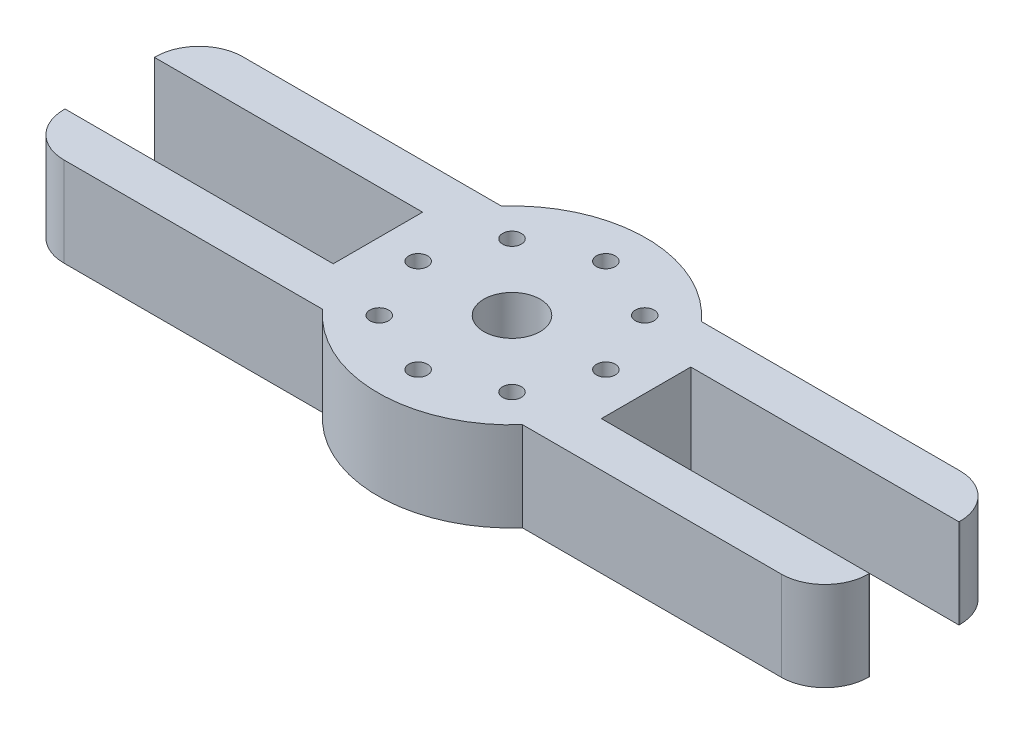
ISO-10303-21;
HEADER;
FILE_DESCRIPTION(('STEP AP214'),'2;1');
FILE_NAME('part.step','',(''),(''),'','','');
FILE_SCHEMA(('AUTOMOTIVE_DESIGN { 1 0 10303 214 1 1 1 1 }'));
ENDSEC;
DATA;
#1=APPLICATION_CONTEXT('core data for automotive mechanical design processes');
#2=APPLICATION_PROTOCOL_DEFINITION('international standard','automotive_design',2000,#1);
#3=PRODUCT_CONTEXT('',#1,'mechanical');
#4=PRODUCT('Part','Part','',(#3));
#5=PRODUCT_RELATED_PRODUCT_CATEGORY('part','',(#4));
#6=PRODUCT_DEFINITION_FORMATION('','',#4);
#7=PRODUCT_DEFINITION_CONTEXT('part definition',#1,'design');
#8=PRODUCT_DEFINITION('design','',#6,#7);
#9=PRODUCT_DEFINITION_SHAPE('','',#8);
#10=(LENGTH_UNIT() NAMED_UNIT(*) SI_UNIT(.MILLI.,.METRE.));
#11=(NAMED_UNIT(*) PLANE_ANGLE_UNIT() SI_UNIT($,.RADIAN.));
#12=(NAMED_UNIT(*) SI_UNIT($,.STERADIAN.) SOLID_ANGLE_UNIT());
#13=UNCERTAINTY_MEASURE_WITH_UNIT(LENGTH_MEASURE(1.E-05),#10,'distance_accuracy_value','');
#14=(GEOMETRIC_REPRESENTATION_CONTEXT(3) GLOBAL_UNCERTAINTY_ASSIGNED_CONTEXT((#13)) GLOBAL_UNIT_ASSIGNED_CONTEXT((#10,
#11,#12)) REPRESENTATION_CONTEXT('',''));
#15=CARTESIAN_POINT('',(0.,0.,0.));
#16=DIRECTION('',(0.,0.,1.));
#17=DIRECTION('',(1.,0.,0.));
#18=AXIS2_PLACEMENT_3D('',#15,#16,#17);
#19=CARTESIAN_POINT('',(0.,20.,0.));
#20=DIRECTION('',(0.,1.,0.));
#21=DIRECTION('',(0.,0.,1.));
#22=AXIS2_PLACEMENT_3D('',#19,#20,#21);
#23=PLANE('',#22);
#24=CARTESIAN_POINT('',(21.,20.,0.));
#25=DIRECTION('',(0.,1.,0.));
#26=DIRECTION('',(0.,0.,1.));
#27=AXIS2_PLACEMENT_3D('',#24,#25,#26);
#28=CIRCLE('',#27,2.1);
#29=CARTESIAN_POINT('',(21.,20.,2.1));
#30=VERTEX_POINT('',#29);
#31=EDGE_CURVE('E460',#30,#30,#28,.T.);
#32=ORIENTED_EDGE('',*,*,#31,.F.);
#33=EDGE_LOOP('',(#32));
#34=FACE_BOUND('',#33,.T.);
#35=CARTESIAN_POINT('',(14.8492424049175,20.,14.8492424049175));
#36=DIRECTION('',(0.,1.,0.));
#37=DIRECTION('',(0.,0.,1.));
#38=AXIS2_PLACEMENT_3D('',#35,#36,#37);
#39=CIRCLE('',#38,2.1);
#40=CARTESIAN_POINT('',(14.8492424049175,20.,16.9492424049175));
#41=VERTEX_POINT('',#40);
#42=EDGE_CURVE('E456',#41,#41,#39,.T.);
#43=ORIENTED_EDGE('',*,*,#42,.F.);
#44=EDGE_LOOP('',(#43));
#45=FACE_BOUND('',#44,.T.);
#46=CARTESIAN_POINT('',(0.,20.,21.));
#47=DIRECTION('',(0.,1.,0.));
#48=DIRECTION('',(0.,0.,1.));
#49=AXIS2_PLACEMENT_3D('',#46,#47,#48);
#50=CIRCLE('',#49,2.1);
#51=CARTESIAN_POINT('',(0.,20.,23.1));
#52=VERTEX_POINT('',#51);
#53=EDGE_CURVE('E448',#52,#52,#50,.T.);
#54=ORIENTED_EDGE('',*,*,#53,.F.);
#55=EDGE_LOOP('',(#54));
#56=FACE_BOUND('',#55,.T.);
#57=CARTESIAN_POINT('',(-14.8492424049176,20.,14.8492424049174));
#58=DIRECTION('',(0.,1.,0.));
#59=DIRECTION('',(0.,0.,1.));
#60=AXIS2_PLACEMENT_3D('',#57,#58,#59);
#61=CIRCLE('',#60,2.1);
#62=CARTESIAN_POINT('',(-14.8492424049176,20.,16.9492424049174));
#63=VERTEX_POINT('',#62);
#64=EDGE_CURVE('E440',#63,#63,#61,.T.);
#65=ORIENTED_EDGE('',*,*,#64,.F.);
#66=EDGE_LOOP('',(#65));
#67=FACE_BOUND('',#66,.T.);
#68=CARTESIAN_POINT('',(-21.,20.,-1.46642216231412E-13));
#69=DIRECTION('',(0.,1.,0.));
#70=DIRECTION('',(0.,0.,1.));
#71=AXIS2_PLACEMENT_3D('',#68,#69,#70);
#72=CIRCLE('',#71,2.1);
#73=CARTESIAN_POINT('',(-21.,20.,2.09999999999985));
#74=VERTEX_POINT('',#73);
#75=EDGE_CURVE('E432',#74,#74,#72,.T.);
#76=ORIENTED_EDGE('',*,*,#75,.F.);
#77=EDGE_LOOP('',(#76));
#78=FACE_BOUND('',#77,.T.);
#79=CARTESIAN_POINT('',(-14.8492424049174,20.,-14.8492424049176));
#80=DIRECTION('',(0.,1.,0.));
#81=DIRECTION('',(0.,0.,1.));
#82=AXIS2_PLACEMENT_3D('',#79,#80,#81);
#83=CIRCLE('',#82,2.1);
#84=CARTESIAN_POINT('',(-14.8492424049174,20.,-12.7492424049176));
#85=VERTEX_POINT('',#84);
#86=EDGE_CURVE('E424',#85,#85,#83,.T.);
#87=ORIENTED_EDGE('',*,*,#86,.F.);
#88=EDGE_LOOP('',(#87));
#89=FACE_BOUND('',#88,.T.);
#90=CARTESIAN_POINT('',(2.19963324347117E-13,20.,-21.));
#91=DIRECTION('',(0.,1.,0.));
#92=DIRECTION('',(0.,0.,1.));
#93=AXIS2_PLACEMENT_3D('',#90,#91,#92);
#94=CIRCLE('',#93,2.1);
#95=CARTESIAN_POINT('',(2.19963324347117E-13,20.,-18.9));
#96=VERTEX_POINT('',#95);
#97=EDGE_CURVE('E416',#96,#96,#94,.T.);
#98=ORIENTED_EDGE('',*,*,#97,.F.);
#99=EDGE_LOOP('',(#98));
#100=FACE_BOUND('',#99,.T.);
#101=CARTESIAN_POINT('',(14.8492424049177,20.,-14.8492424049173));
#102=DIRECTION('',(0.,1.,0.));
#103=DIRECTION('',(0.,0.,1.));
#104=AXIS2_PLACEMENT_3D('',#101,#102,#103);
#105=CIRCLE('',#104,2.1);
#106=CARTESIAN_POINT('',(14.8492424049177,20.,-12.7492424049173));
#107=VERTEX_POINT('',#106);
#108=EDGE_CURVE('E407',#107,#107,#105,.T.);
#109=ORIENTED_EDGE('',*,*,#108,.F.);
#110=EDGE_LOOP('',(#109));
#111=FACE_BOUND('',#110,.T.);
#112=DIRECTION('',(0.,0.,-1.));
#113=VECTOR('',#112,1.);
#114=CARTESIAN_POINT('',(-90.,20.,-20.));
#115=LINE('',#114,#113);
#116=CARTESIAN_POINT('',(-90.,20.,10.25));
#117=VERTEX_POINT('',#116);
#118=CARTESIAN_POINT('',(-90.,20.,10.));
#119=VERTEX_POINT('',#118);
#120=EDGE_CURVE('E183',#117,#119,#115,.T.);
#121=ORIENTED_EDGE('',*,*,#120,.F.);
#122=CARTESIAN_POINT('',(-80.25,20.,10.25));
#123=DIRECTION('',(0.,1.,0.));
#124=DIRECTION('',(0.,0.,1.));
#125=AXIS2_PLACEMENT_3D('',#122,#123,#124);
#126=CIRCLE('',#125,9.75);
#127=CARTESIAN_POINT('',(-80.25,20.,20.));
#128=VERTEX_POINT('',#127);
#129=EDGE_CURVE('E384',#117,#128,#126,.T.);
#130=ORIENTED_EDGE('',*,*,#129,.T.);
#131=DIRECTION('',(-1.,0.,0.));
#132=VECTOR('',#131,1.);
#133=CARTESIAN_POINT('',(-90.,20.,20.));
#134=LINE('',#133,#132);
#135=CARTESIAN_POINT('',(-22.3606797749979,20.,20.));
#136=VERTEX_POINT('',#135);
#137=EDGE_CURVE('E193',#136,#128,#134,.T.);
#138=ORIENTED_EDGE('',*,*,#137,.F.);
#139=CARTESIAN_POINT('',(0.,20.,0.));
#140=DIRECTION('',(0.,1.,0.));
#141=DIRECTION('',(0.,0.,1.));
#142=AXIS2_PLACEMENT_3D('',#139,#140,#141);
#143=CIRCLE('',#142,30.);
#144=CARTESIAN_POINT('',(22.3606797749979,20.,20.));
#145=VERTEX_POINT('',#144);
#146=EDGE_CURVE('E305',#136,#145,#143,.T.);
#147=ORIENTED_EDGE('',*,*,#146,.T.);
#148=DIRECTION('',(1.,0.,0.));
#149=VECTOR('',#148,1.);
#150=CARTESIAN_POINT('',(90.,20.,20.));
#151=LINE('',#150,#149);
#152=CARTESIAN_POINT('',(80.25,20.,20.));
#153=VERTEX_POINT('',#152);
#154=EDGE_CURVE('E309',#145,#153,#151,.T.);
#155=ORIENTED_EDGE('',*,*,#154,.T.);
#156=CARTESIAN_POINT('',(80.25,20.,10.25));
#157=DIRECTION('',(0.,1.,0.));
#158=DIRECTION('',(0.,0.,1.));
#159=AXIS2_PLACEMENT_3D('',#156,#157,#158);
#160=CIRCLE('',#159,9.75);
#161=CARTESIAN_POINT('',(90.,20.,10.25));
#162=VERTEX_POINT('',#161);
#163=EDGE_CURVE('E360',#153,#162,#160,.T.);
#164=ORIENTED_EDGE('',*,*,#163,.T.);
#165=DIRECTION('',(0.,0.,-1.));
#166=VECTOR('',#165,1.);
#167=CARTESIAN_POINT('',(90.,20.,-20.));
#168=LINE('',#167,#166);
#169=CARTESIAN_POINT('',(90.,20.,10.));
#170=VERTEX_POINT('',#169);
#171=EDGE_CURVE('E314',#162,#170,#168,.T.);
#172=ORIENTED_EDGE('',*,*,#171,.T.);
#173=DIRECTION('',(1.,0.,0.));
#174=VECTOR('',#173,1.);
#175=CARTESIAN_POINT('',(30.,20.,10.));
#176=LINE('',#175,#174);
#177=CARTESIAN_POINT('',(30.,20.,10.));
#178=VERTEX_POINT('',#177);
#179=EDGE_CURVE('E274',#178,#170,#176,.T.);
#180=ORIENTED_EDGE('',*,*,#179,.F.);
#181=DIRECTION('',(0.,0.,1.));
#182=VECTOR('',#181,1.);
#183=CARTESIAN_POINT('',(30.,20.,-10.));
#184=LINE('',#183,#182);
#185=CARTESIAN_POINT('',(30.,20.,-10.));
#186=VERTEX_POINT('',#185);
#187=EDGE_CURVE('E289',#186,#178,#184,.T.);
#188=ORIENTED_EDGE('',*,*,#187,.F.);
#189=DIRECTION('',(-1.,0.,0.));
#190=VECTOR('',#189,1.);
#191=CARTESIAN_POINT('',(90.,20.,-10.));
#192=LINE('',#191,#190);
#193=CARTESIAN_POINT('',(90.,20.,-10.));
#194=VERTEX_POINT('',#193);
#195=EDGE_CURVE('E267',#194,#186,#192,.T.);
#196=ORIENTED_EDGE('',*,*,#195,.F.);
#197=CARTESIAN_POINT('',(90.,20.,-10.25));
#198=VERTEX_POINT('',#197);
#199=EDGE_CURVE('E313',#194,#198,#168,.T.);
#200=ORIENTED_EDGE('',*,*,#199,.T.);
#201=CARTESIAN_POINT('',(80.25,20.,-10.25));
#202=DIRECTION('',(0.,1.,0.));
#203=DIRECTION('',(0.,0.,1.));
#204=AXIS2_PLACEMENT_3D('',#201,#202,#203);
#205=CIRCLE('',#204,9.75);
#206=CARTESIAN_POINT('',(80.25,20.,-20.));
#207=VERTEX_POINT('',#206);
#208=EDGE_CURVE('E357',#198,#207,#205,.T.);
#209=ORIENTED_EDGE('',*,*,#208,.T.);
#210=DIRECTION('',(-1.,0.,0.));
#211=VECTOR('',#210,1.);
#212=CARTESIAN_POINT('',(22.3606797749979,20.,-20.));
#213=LINE('',#212,#211);
#214=CARTESIAN_POINT('',(22.3606797749979,20.,-20.));
#215=VERTEX_POINT('',#214);
#216=EDGE_CURVE('E317',#207,#215,#213,.T.);
#217=ORIENTED_EDGE('',*,*,#216,.T.);
#218=CARTESIAN_POINT('',(0.,20.,0.));
#219=DIRECTION('',(0.,1.,0.));
#220=DIRECTION('',(0.,0.,1.));
#221=AXIS2_PLACEMENT_3D('',#218,#219,#220);
#222=CIRCLE('',#221,30.);
#223=CARTESIAN_POINT('',(-22.3606797749979,20.,-20.));
#224=VERTEX_POINT('',#223);
#225=EDGE_CURVE('E301',#215,#224,#222,.T.);
#226=ORIENTED_EDGE('',*,*,#225,.T.);
#227=DIRECTION('',(1.,0.,0.));
#228=VECTOR('',#227,1.);
#229=CARTESIAN_POINT('',(-22.3606797749979,20.,-20.));
#230=LINE('',#229,#228);
#231=CARTESIAN_POINT('',(-80.25,20.,-20.));
#232=VERTEX_POINT('',#231);
#233=EDGE_CURVE('E231',#232,#224,#230,.T.);
#234=ORIENTED_EDGE('',*,*,#233,.F.);
#235=CARTESIAN_POINT('',(-80.25,20.,-10.25));
#236=DIRECTION('',(0.,1.,0.));
#237=DIRECTION('',(0.,0.,1.));
#238=AXIS2_PLACEMENT_3D('',#235,#236,#237);
#239=CIRCLE('',#238,9.75);
#240=CARTESIAN_POINT('',(-90.,20.,-10.25));
#241=VERTEX_POINT('',#240);
#242=EDGE_CURVE('E61',#232,#241,#239,.T.);
#243=ORIENTED_EDGE('',*,*,#242,.T.);
#244=CARTESIAN_POINT('',(-90.,20.,-10.));
#245=VERTEX_POINT('',#244);
#246=EDGE_CURVE('E194',#245,#241,#115,.T.);
#247=ORIENTED_EDGE('',*,*,#246,.F.);
#248=DIRECTION('',(1.,0.,0.));
#249=VECTOR('',#248,1.);
#250=CARTESIAN_POINT('',(-90.,20.,-10.));
#251=LINE('',#250,#249);
#252=CARTESIAN_POINT('',(-30.,20.,-10.));
#253=VERTEX_POINT('',#252);
#254=EDGE_CURVE('E214',#245,#253,#251,.T.);
#255=ORIENTED_EDGE('',*,*,#254,.T.);
#256=DIRECTION('',(0.,0.,1.));
#257=VECTOR('',#256,1.);
#258=CARTESIAN_POINT('',(-30.,20.,-10.));
#259=LINE('',#258,#257);
#260=CARTESIAN_POINT('',(-30.,20.,10.));
#261=VERTEX_POINT('',#260);
#262=EDGE_CURVE('E212',#253,#261,#259,.T.);
#263=ORIENTED_EDGE('',*,*,#262,.T.);
#264=DIRECTION('',(-1.,0.,0.));
#265=VECTOR('',#264,1.);
#266=CARTESIAN_POINT('',(-30.,20.,10.));
#267=LINE('',#266,#265);
#268=EDGE_CURVE('E201',#261,#119,#267,.T.);
#269=ORIENTED_EDGE('',*,*,#268,.T.);
#270=EDGE_LOOP('',(#121,#130,#138,#147,#155,#164,#172,#180,#188,#196,#200,#209,#217,#226,#234,
#243,#247,#255,#263,#269));
#271=FACE_BOUND('',#270,.T.);
#272=CARTESIAN_POINT('',(0.,20.,0.));
#273=DIRECTION('',(0.,1.,0.));
#274=DIRECTION('',(0.,0.,1.));
#275=AXIS2_PLACEMENT_3D('',#272,#273,#274);
#276=CIRCLE('',#275,6.3);
#277=CARTESIAN_POINT('',(0.,20.,6.3));
#278=VERTEX_POINT('',#277);
#279=EDGE_CURVE('E263',#278,#278,#276,.T.);
#280=ORIENTED_EDGE('',*,*,#279,.F.);
#281=EDGE_LOOP('',(#280));
#282=FACE_BOUND('',#281,.T.);
#283=ADVANCED_FACE('F45',(#34,#45,#56,#67,#78,#89,#100,#111,#271,#282),#23,.T.);
#284=CARTESIAN_POINT('',(0.,0.,0.));
#285=DIRECTION('',(0.,1.,0.));
#286=DIRECTION('',(0.,0.,1.));
#287=AXIS2_PLACEMENT_3D('',#284,#285,#286);
#288=PLANE('',#287);
#289=CARTESIAN_POINT('',(21.,0.,0.));
#290=DIRECTION('',(0.,1.,0.));
#291=DIRECTION('',(0.,0.,1.));
#292=AXIS2_PLACEMENT_3D('',#289,#290,#291);
#293=CIRCLE('',#292,2.1);
#294=CARTESIAN_POINT('',(21.,0.,2.1));
#295=VERTEX_POINT('',#294);
#296=EDGE_CURVE('E219',#295,#295,#293,.F.);
#297=ORIENTED_EDGE('',*,*,#296,.F.);
#298=EDGE_LOOP('',(#297));
#299=FACE_BOUND('',#298,.T.);
#300=CARTESIAN_POINT('',(14.8492424049175,0.,14.8492424049175));
#301=DIRECTION('',(0.,1.,0.));
#302=DIRECTION('',(0.,0.,1.));
#303=AXIS2_PLACEMENT_3D('',#300,#301,#302);
#304=CIRCLE('',#303,2.1);
#305=CARTESIAN_POINT('',(14.8492424049175,0.,16.9492424049175));
#306=VERTEX_POINT('',#305);
#307=EDGE_CURVE('E452',#306,#306,#304,.F.);
#308=ORIENTED_EDGE('',*,*,#307,.F.);
#309=EDGE_LOOP('',(#308));
#310=FACE_BOUND('',#309,.T.);
#311=CARTESIAN_POINT('',(0.,0.,21.));
#312=DIRECTION('',(0.,1.,0.));
#313=DIRECTION('',(0.,0.,1.));
#314=AXIS2_PLACEMENT_3D('',#311,#312,#313);
#315=CIRCLE('',#314,2.1);
#316=CARTESIAN_POINT('',(0.,0.,23.1));
#317=VERTEX_POINT('',#316);
#318=EDGE_CURVE('E444',#317,#317,#315,.F.);
#319=ORIENTED_EDGE('',*,*,#318,.F.);
#320=EDGE_LOOP('',(#319));
#321=FACE_BOUND('',#320,.T.);
#322=CARTESIAN_POINT('',(-14.8492424049176,0.,14.8492424049174));
#323=DIRECTION('',(0.,1.,0.));
#324=DIRECTION('',(0.,0.,1.));
#325=AXIS2_PLACEMENT_3D('',#322,#323,#324);
#326=CIRCLE('',#325,2.1);
#327=CARTESIAN_POINT('',(-14.8492424049176,0.,16.9492424049174));
#328=VERTEX_POINT('',#327);
#329=EDGE_CURVE('E436',#328,#328,#326,.F.);
#330=ORIENTED_EDGE('',*,*,#329,.F.);
#331=EDGE_LOOP('',(#330));
#332=FACE_BOUND('',#331,.T.);
#333=CARTESIAN_POINT('',(-21.,0.,-1.46642216231412E-13));
#334=DIRECTION('',(0.,1.,0.));
#335=DIRECTION('',(0.,0.,1.));
#336=AXIS2_PLACEMENT_3D('',#333,#334,#335);
#337=CIRCLE('',#336,2.1);
#338=CARTESIAN_POINT('',(-21.,0.,2.09999999999985));
#339=VERTEX_POINT('',#338);
#340=EDGE_CURVE('E428',#339,#339,#337,.F.);
#341=ORIENTED_EDGE('',*,*,#340,.F.);
#342=EDGE_LOOP('',(#341));
#343=FACE_BOUND('',#342,.T.);
#344=CARTESIAN_POINT('',(-14.8492424049174,0.,-14.8492424049176));
#345=DIRECTION('',(0.,1.,0.));
#346=DIRECTION('',(0.,0.,1.));
#347=AXIS2_PLACEMENT_3D('',#344,#345,#346);
#348=CIRCLE('',#347,2.1);
#349=CARTESIAN_POINT('',(-14.8492424049174,0.,-12.7492424049176));
#350=VERTEX_POINT('',#349);
#351=EDGE_CURVE('E420',#350,#350,#348,.F.);
#352=ORIENTED_EDGE('',*,*,#351,.F.);
#353=EDGE_LOOP('',(#352));
#354=FACE_BOUND('',#353,.T.);
#355=CARTESIAN_POINT('',(2.19963324347117E-13,0.,-21.));
#356=DIRECTION('',(0.,1.,0.));
#357=DIRECTION('',(0.,0.,1.));
#358=AXIS2_PLACEMENT_3D('',#355,#356,#357);
#359=CIRCLE('',#358,2.1);
#360=CARTESIAN_POINT('',(2.19963324347117E-13,0.,-18.9));
#361=VERTEX_POINT('',#360);
#362=EDGE_CURVE('E411',#361,#361,#359,.F.);
#363=ORIENTED_EDGE('',*,*,#362,.F.);
#364=EDGE_LOOP('',(#363));
#365=FACE_BOUND('',#364,.T.);
#366=CARTESIAN_POINT('',(14.8492424049177,0.,-14.8492424049173));
#367=DIRECTION('',(0.,1.,0.));
#368=DIRECTION('',(0.,0.,1.));
#369=AXIS2_PLACEMENT_3D('',#366,#367,#368);
#370=CIRCLE('',#369,2.1);
#371=CARTESIAN_POINT('',(14.8492424049177,0.,-12.7492424049173));
#372=VERTEX_POINT('',#371);
#373=EDGE_CURVE('E412',#372,#372,#370,.F.);
#374=ORIENTED_EDGE('',*,*,#373,.F.);
#375=EDGE_LOOP('',(#374));
#376=FACE_BOUND('',#375,.T.);
#377=DIRECTION('',(-1.,0.,0.));
#378=VECTOR('',#377,1.);
#379=CARTESIAN_POINT('',(-90.,0.,20.));
#380=LINE('',#379,#378);
#381=CARTESIAN_POINT('',(-22.3606797749979,0.,20.));
#382=VERTEX_POINT('',#381);
#383=CARTESIAN_POINT('',(-80.25,0.,20.));
#384=VERTEX_POINT('',#383);
#385=EDGE_CURVE('E233',#382,#384,#380,.T.);
#386=ORIENTED_EDGE('',*,*,#385,.T.);
#387=CARTESIAN_POINT('',(-80.25,0.,10.25));
#388=DIRECTION('',(0.,1.,0.));
#389=DIRECTION('',(0.,0.,1.));
#390=AXIS2_PLACEMENT_3D('',#387,#388,#389);
#391=CIRCLE('',#390,9.75);
#392=CARTESIAN_POINT('',(-90.,0.,10.25));
#393=VERTEX_POINT('',#392);
#394=EDGE_CURVE('E377',#384,#393,#391,.F.);
#395=ORIENTED_EDGE('',*,*,#394,.T.);
#396=DIRECTION('',(0.,0.,-1.));
#397=VECTOR('',#396,1.);
#398=CARTESIAN_POINT('',(-90.,0.,-20.));
#399=LINE('',#398,#397);
#400=CARTESIAN_POINT('',(-90.,0.,10.));
#401=VERTEX_POINT('',#400);
#402=EDGE_CURVE('E244',#393,#401,#399,.T.);
#403=ORIENTED_EDGE('',*,*,#402,.T.);
#404=DIRECTION('',(1.,0.,0.));
#405=VECTOR('',#404,1.);
#406=CARTESIAN_POINT('',(-30.,0.,10.));
#407=LINE('',#406,#405);
#408=CARTESIAN_POINT('',(-30.,0.,10.));
#409=VERTEX_POINT('',#408);
#410=EDGE_CURVE('E204',#401,#409,#407,.T.);
#411=ORIENTED_EDGE('',*,*,#410,.T.);
#412=DIRECTION('',(0.,0.,-1.));
#413=VECTOR('',#412,1.);
#414=CARTESIAN_POINT('',(-30.,0.,-10.));
#415=LINE('',#414,#413);
#416=CARTESIAN_POINT('',(-30.,0.,-10.));
#417=VERTEX_POINT('',#416);
#418=EDGE_CURVE('E402',#409,#417,#415,.T.);
#419=ORIENTED_EDGE('',*,*,#418,.T.);
#420=DIRECTION('',(-1.,0.,0.));
#421=VECTOR('',#420,1.);
#422=CARTESIAN_POINT('',(-90.,0.,-10.));
#423=LINE('',#422,#421);
#424=CARTESIAN_POINT('',(-90.,0.,-10.));
#425=VERTEX_POINT('',#424);
#426=EDGE_CURVE('E243',#417,#425,#423,.T.);
#427=ORIENTED_EDGE('',*,*,#426,.T.);
#428=CARTESIAN_POINT('',(-90.,0.,-10.25));
#429=VERTEX_POINT('',#428);
#430=EDGE_CURVE('E242',#425,#429,#399,.T.);
#431=ORIENTED_EDGE('',*,*,#430,.T.);
#432=CARTESIAN_POINT('',(-80.25,0.,-10.25));
#433=DIRECTION('',(0.,1.,0.));
#434=DIRECTION('',(0.,0.,1.));
#435=AXIS2_PLACEMENT_3D('',#432,#433,#434);
#436=CIRCLE('',#435,9.75);
#437=CARTESIAN_POINT('',(-80.25,0.,-20.));
#438=VERTEX_POINT('',#437);
#439=EDGE_CURVE('E374',#429,#438,#436,.F.);
#440=ORIENTED_EDGE('',*,*,#439,.T.);
#441=DIRECTION('',(1.,0.,0.));
#442=VECTOR('',#441,1.);
#443=CARTESIAN_POINT('',(-22.3606797749979,0.,-20.));
#444=LINE('',#443,#442);
#445=CARTESIAN_POINT('',(-22.3606797749979,0.,-20.));
#446=VERTEX_POINT('',#445);
#447=EDGE_CURVE('E239',#438,#446,#444,.T.);
#448=ORIENTED_EDGE('',*,*,#447,.T.);
#449=CARTESIAN_POINT('',(0.,0.,0.));
#450=DIRECTION('',(0.,1.,0.));
#451=DIRECTION('',(0.,0.,1.));
#452=AXIS2_PLACEMENT_3D('',#449,#450,#451);
#453=CIRCLE('',#452,30.);
#454=CARTESIAN_POINT('',(22.3606797749979,0.,-20.));
#455=VERTEX_POINT('',#454);
#456=EDGE_CURVE('E262',#455,#446,#453,.T.);
#457=ORIENTED_EDGE('',*,*,#456,.F.);
#458=DIRECTION('',(-1.,0.,0.));
#459=VECTOR('',#458,1.);
#460=CARTESIAN_POINT('',(22.3606797749979,0.,-20.));
#461=LINE('',#460,#459);
#462=CARTESIAN_POINT('',(80.25,0.,-20.));
#463=VERTEX_POINT('',#462);
#464=EDGE_CURVE('E306',#463,#455,#461,.T.);
#465=ORIENTED_EDGE('',*,*,#464,.F.);
#466=CARTESIAN_POINT('',(80.25,0.,-10.25));
#467=DIRECTION('',(0.,1.,0.));
#468=DIRECTION('',(0.,0.,1.));
#469=AXIS2_PLACEMENT_3D('',#466,#467,#468);
#470=CIRCLE('',#469,9.75);
#471=CARTESIAN_POINT('',(90.,0.,-10.25));
#472=VERTEX_POINT('',#471);
#473=EDGE_CURVE('E348',#463,#472,#470,.F.);
#474=ORIENTED_EDGE('',*,*,#473,.T.);
#475=DIRECTION('',(0.,0.,-1.));
#476=VECTOR('',#475,1.);
#477=CARTESIAN_POINT('',(90.,0.,-20.));
#478=LINE('',#477,#476);
#479=CARTESIAN_POINT('',(90.,0.,-10.));
#480=VERTEX_POINT('',#479);
#481=EDGE_CURVE('E331',#480,#472,#478,.T.);
#482=ORIENTED_EDGE('',*,*,#481,.F.);
#483=DIRECTION('',(1.,0.,0.));
#484=VECTOR('',#483,1.);
#485=CARTESIAN_POINT('',(90.,0.,-10.));
#486=LINE('',#485,#484);
#487=CARTESIAN_POINT('',(30.,0.,-10.));
#488=VERTEX_POINT('',#487);
#489=EDGE_CURVE('E270',#488,#480,#486,.T.);
#490=ORIENTED_EDGE('',*,*,#489,.F.);
#491=DIRECTION('',(0.,0.,-1.));
#492=VECTOR('',#491,1.);
#493=CARTESIAN_POINT('',(30.,0.,-10.));
#494=LINE('',#493,#492);
#495=CARTESIAN_POINT('',(30.,0.,10.));
#496=VERTEX_POINT('',#495);
#497=EDGE_CURVE('E257',#496,#488,#494,.T.);
#498=ORIENTED_EDGE('',*,*,#497,.F.);
#499=DIRECTION('',(-1.,0.,0.));
#500=VECTOR('',#499,1.);
#501=CARTESIAN_POINT('',(30.,0.,10.));
#502=LINE('',#501,#500);
#503=CARTESIAN_POINT('',(90.,0.,10.));
#504=VERTEX_POINT('',#503);
#505=EDGE_CURVE('E285',#504,#496,#502,.T.);
#506=ORIENTED_EDGE('',*,*,#505,.F.);
#507=CARTESIAN_POINT('',(90.,0.,10.25));
#508=VERTEX_POINT('',#507);
#509=EDGE_CURVE('E332',#508,#504,#478,.T.);
#510=ORIENTED_EDGE('',*,*,#509,.F.);
#511=CARTESIAN_POINT('',(80.25,0.,10.25));
#512=DIRECTION('',(0.,1.,0.));
#513=DIRECTION('',(0.,0.,1.));
#514=AXIS2_PLACEMENT_3D('',#511,#512,#513);
#515=CIRCLE('',#514,9.75);
#516=CARTESIAN_POINT('',(80.25,0.,20.));
#517=VERTEX_POINT('',#516);
#518=EDGE_CURVE('E351',#508,#517,#515,.F.);
#519=ORIENTED_EDGE('',*,*,#518,.T.);
#520=DIRECTION('',(1.,0.,0.));
#521=VECTOR('',#520,1.);
#522=CARTESIAN_POINT('',(90.,0.,20.));
#523=LINE('',#522,#521);
#524=CARTESIAN_POINT('',(22.3606797749979,0.,20.));
#525=VERTEX_POINT('',#524);
#526=EDGE_CURVE('E327',#525,#517,#523,.T.);
#527=ORIENTED_EDGE('',*,*,#526,.F.);
#528=CARTESIAN_POINT('',(0.,0.,0.));
#529=DIRECTION('',(0.,1.,0.));
#530=DIRECTION('',(0.,0.,1.));
#531=AXIS2_PLACEMENT_3D('',#528,#529,#530);
#532=CIRCLE('',#531,30.);
#533=EDGE_CURVE('E324',#382,#525,#532,.T.);
#534=ORIENTED_EDGE('',*,*,#533,.F.);
#535=EDGE_LOOP('',(#386,#395,#403,#411,#419,#427,#431,#440,#448,#457,#465,#474,#482,#490,#498,
#506,#510,#519,#527,#534));
#536=FACE_BOUND('',#535,.T.);
#537=CARTESIAN_POINT('',(0.,0.,0.));
#538=DIRECTION('',(0.,1.,0.));
#539=DIRECTION('',(0.,0.,1.));
#540=AXIS2_PLACEMENT_3D('',#537,#538,#539);
#541=CIRCLE('',#540,6.3);
#542=CARTESIAN_POINT('',(0.,0.,6.3));
#543=VERTEX_POINT('',#542);
#544=EDGE_CURVE('E258',#543,#543,#541,.F.);
#545=ORIENTED_EDGE('',*,*,#544,.F.);
#546=EDGE_LOOP('',(#545));
#547=FACE_BOUND('',#546,.T.);
#548=ADVANCED_FACE('F396',(#299,#310,#321,#332,#343,#354,#365,#376,#536,#547),#288,.F.);
#549=CARTESIAN_POINT('',(-90.,20.,-20.));
#550=DIRECTION('',(-1.,0.,0.));
#551=DIRECTION('',(0.,0.,1.));
#552=AXIS2_PLACEMENT_3D('',#549,#550,#551);
#553=PLANE('',#552);
#554=ORIENTED_EDGE('',*,*,#402,.F.);
#555=DIRECTION('',(0.,-1.,0.));
#556=VECTOR('',#555,1.);
#557=CARTESIAN_POINT('',(-90.,20.,10.25));
#558=LINE('',#557,#556);
#559=EDGE_CURVE('E189',#393,#117,#558,.F.);
#560=ORIENTED_EDGE('',*,*,#559,.T.);
#561=ORIENTED_EDGE('',*,*,#120,.T.);
#562=DIRECTION('',(0.,1.,0.));
#563=VECTOR('',#562,1.);
#564=CARTESIAN_POINT('',(-90.,-63.2455532033676,10.));
#565=LINE('',#564,#563);
#566=EDGE_CURVE('E187',#401,#119,#565,.T.);
#567=ORIENTED_EDGE('',*,*,#566,.F.);
#568=EDGE_LOOP('',(#554,#560,#561,#567));
#569=FACE_BOUND('',#568,.T.);
#570=ADVANCED_FACE('F186',(#569),#553,.T.);
#571=ORIENTED_EDGE('',*,*,#246,.T.);
#572=DIRECTION('',(0.,-1.,0.));
#573=VECTOR('',#572,1.);
#574=CARTESIAN_POINT('',(-90.,20.,-10.25));
#575=LINE('',#574,#573);
#576=EDGE_CURVE('E54',#241,#429,#575,.T.);
#577=ORIENTED_EDGE('',*,*,#576,.T.);
#578=ORIENTED_EDGE('',*,*,#430,.F.);
#579=DIRECTION('',(0.,1.,0.));
#580=VECTOR('',#579,1.);
#581=CARTESIAN_POINT('',(-90.,-63.2455532033676,-10.));
#582=LINE('',#581,#580);
#583=EDGE_CURVE('E207',#425,#245,#582,.T.);
#584=ORIENTED_EDGE('',*,*,#583,.T.);
#585=EDGE_LOOP('',(#571,#577,#578,#584));
#586=FACE_BOUND('',#585,.T.);
#587=ADVANCED_FACE('F392',(#586),#553,.T.);
#588=CARTESIAN_POINT('',(90.,20.,-20.));
#589=DIRECTION('',(-1.,0.,0.));
#590=DIRECTION('',(0.,0.,1.));
#591=AXIS2_PLACEMENT_3D('',#588,#589,#590);
#592=PLANE('',#591);
#593=ORIENTED_EDGE('',*,*,#481,.T.);
#594=DIRECTION('',(0.,-1.,0.));
#595=VECTOR('',#594,1.);
#596=CARTESIAN_POINT('',(90.,20.,-10.25));
#597=LINE('',#596,#595);
#598=EDGE_CURVE('E367',#472,#198,#597,.F.);
#599=ORIENTED_EDGE('',*,*,#598,.T.);
#600=ORIENTED_EDGE('',*,*,#199,.F.);
#601=DIRECTION('',(0.,1.,0.));
#602=VECTOR('',#601,1.);
#603=CARTESIAN_POINT('',(90.,-63.2455532033676,-10.));
#604=LINE('',#603,#602);
#605=EDGE_CURVE('E282',#480,#194,#604,.T.);
#606=ORIENTED_EDGE('',*,*,#605,.F.);
#607=EDGE_LOOP('',(#593,#599,#600,#606));
#608=FACE_BOUND('',#607,.T.);
#609=ADVANCED_FACE('F554',(#608),#592,.F.);
#610=CARTESIAN_POINT('',(0.,20.,0.));
#611=DIRECTION('',(0.,-1.,0.));
#612=DIRECTION('',(0.,0.,-1.));
#613=AXIS2_PLACEMENT_3D('',#610,#611,#612);
#614=CYLINDRICAL_SURFACE('',#613,30.);
#615=ORIENTED_EDGE('',*,*,#456,.T.);
#616=DIRECTION('',(0.,-1.,0.));
#617=VECTOR('',#616,1.);
#618=CARTESIAN_POINT('',(-22.3606797749979,20.,-20.));
#619=LINE('',#618,#617);
#620=EDGE_CURVE('E253',#224,#446,#619,.T.);
#621=ORIENTED_EDGE('',*,*,#620,.F.);
#622=ORIENTED_EDGE('',*,*,#225,.F.);
#623=DIRECTION('',(0.,-1.,0.));
#624=VECTOR('',#623,1.);
#625=CARTESIAN_POINT('',(22.3606797749979,20.,-20.));
#626=LINE('',#625,#624);
#627=EDGE_CURVE('E320',#215,#455,#626,.T.);
#628=ORIENTED_EDGE('',*,*,#627,.T.);
#629=EDGE_LOOP('',(#615,#621,#622,#628));
#630=FACE_BOUND('',#629,.T.);
#631=ADVANCED_FACE('F561',(#630),#614,.T.);
#632=CARTESIAN_POINT('',(0.,20.,0.));
#633=DIRECTION('',(0.,-1.,0.));
#634=DIRECTION('',(0.,0.,-1.));
#635=AXIS2_PLACEMENT_3D('',#632,#633,#634);
#636=CYLINDRICAL_SURFACE('',#635,30.);
#637=ORIENTED_EDGE('',*,*,#533,.T.);
#638=DIRECTION('',(0.,-1.,0.));
#639=VECTOR('',#638,1.);
#640=CARTESIAN_POINT('',(22.3606797749979,20.,20.));
#641=LINE('',#640,#639);
#642=EDGE_CURVE('E340',#145,#525,#641,.T.);
#643=ORIENTED_EDGE('',*,*,#642,.F.);
#644=ORIENTED_EDGE('',*,*,#146,.F.);
#645=DIRECTION('',(0.,-1.,0.));
#646=VECTOR('',#645,1.);
#647=CARTESIAN_POINT('',(-22.3606797749979,20.,20.));
#648=LINE('',#647,#646);
#649=EDGE_CURVE('E238',#136,#382,#648,.T.);
#650=ORIENTED_EDGE('',*,*,#649,.T.);
#651=EDGE_LOOP('',(#637,#643,#644,#650));
#652=FACE_BOUND('',#651,.T.);
#653=ADVANCED_FACE('F557',(#652),#636,.T.);
#654=CARTESIAN_POINT('',(90.,20.,20.));
#655=DIRECTION('',(0.,0.,-1.));
#656=DIRECTION('',(-1.,0.,0.));
#657=AXIS2_PLACEMENT_3D('',#654,#655,#656);
#658=PLANE('',#657);
#659=ORIENTED_EDGE('',*,*,#526,.T.);
#660=DIRECTION('',(0.,-1.,0.));
#661=VECTOR('',#660,1.);
#662=CARTESIAN_POINT('',(80.25,20.,20.));
#663=LINE('',#662,#661);
#664=EDGE_CURVE('E354',#517,#153,#663,.F.);
#665=ORIENTED_EDGE('',*,*,#664,.T.);
#666=ORIENTED_EDGE('',*,*,#154,.F.);
#667=ORIENTED_EDGE('',*,*,#642,.T.);
#668=EDGE_LOOP('',(#659,#665,#666,#667));
#669=FACE_BOUND('',#668,.T.);
#670=ADVANCED_FACE('F552',(#669),#658,.F.);
#671=ORIENTED_EDGE('',*,*,#171,.F.);
#672=DIRECTION('',(0.,-1.,0.));
#673=VECTOR('',#672,1.);
#674=CARTESIAN_POINT('',(90.,20.,10.25));
#675=LINE('',#674,#673);
#676=EDGE_CURVE('E344',#162,#508,#675,.T.);
#677=ORIENTED_EDGE('',*,*,#676,.T.);
#678=ORIENTED_EDGE('',*,*,#509,.T.);
#679=DIRECTION('',(0.,1.,0.));
#680=VECTOR('',#679,1.);
#681=CARTESIAN_POINT('',(90.,-63.2455532033676,10.));
#682=LINE('',#681,#680);
#683=EDGE_CURVE('E278',#504,#170,#682,.T.);
#684=ORIENTED_EDGE('',*,*,#683,.T.);
#685=EDGE_LOOP('',(#671,#677,#678,#684));
#686=FACE_BOUND('',#685,.T.);
#687=ADVANCED_FACE('F548',(#686),#592,.F.);
#688=CARTESIAN_POINT('',(22.3606797749979,20.,-20.));
#689=DIRECTION('',(0.,0.,1.));
#690=DIRECTION('',(1.,0.,0.));
#691=AXIS2_PLACEMENT_3D('',#688,#689,#690);
#692=PLANE('',#691);
#693=ORIENTED_EDGE('',*,*,#216,.F.);
#694=DIRECTION('',(0.,-1.,0.));
#695=VECTOR('',#694,1.);
#696=CARTESIAN_POINT('',(80.25,20.,-20.));
#697=LINE('',#696,#695);
#698=EDGE_CURVE('E363',#207,#463,#697,.T.);
#699=ORIENTED_EDGE('',*,*,#698,.T.);
#700=ORIENTED_EDGE('',*,*,#464,.T.);
#701=ORIENTED_EDGE('',*,*,#627,.F.);
#702=EDGE_LOOP('',(#693,#699,#700,#701));
#703=FACE_BOUND('',#702,.T.);
#704=ADVANCED_FACE('F536',(#703),#692,.F.);
#705=CARTESIAN_POINT('',(90.,-63.2455532033676,-10.));
#706=DIRECTION('',(0.,0.,-1.));
#707=DIRECTION('',(-1.,0.,0.));
#708=AXIS2_PLACEMENT_3D('',#705,#706,#707);
#709=PLANE('',#708);
#710=ORIENTED_EDGE('',*,*,#489,.T.);
#711=ORIENTED_EDGE('',*,*,#605,.T.);
#712=ORIENTED_EDGE('',*,*,#195,.T.);
#713=DIRECTION('',(0.,1.,0.));
#714=VECTOR('',#713,1.);
#715=CARTESIAN_POINT('',(30.,-63.2455532033676,-10.));
#716=LINE('',#715,#714);
#717=EDGE_CURVE('E271',#488,#186,#716,.T.);
#718=ORIENTED_EDGE('',*,*,#717,.F.);
#719=EDGE_LOOP('',(#710,#711,#712,#718));
#720=FACE_BOUND('',#719,.T.);
#721=ADVANCED_FACE('F532',(#720),#709,.F.);
#722=CARTESIAN_POINT('',(30.,-63.2455532033676,10.));
#723=DIRECTION('',(0.,0.,1.));
#724=DIRECTION('',(1.,0.,0.));
#725=AXIS2_PLACEMENT_3D('',#722,#723,#724);
#726=PLANE('',#725);
#727=ORIENTED_EDGE('',*,*,#505,.T.);
#728=DIRECTION('',(0.,1.,0.));
#729=VECTOR('',#728,1.);
#730=CARTESIAN_POINT('',(30.,-63.2455532033676,10.));
#731=LINE('',#730,#729);
#732=EDGE_CURVE('E275',#496,#178,#731,.T.);
#733=ORIENTED_EDGE('',*,*,#732,.T.);
#734=ORIENTED_EDGE('',*,*,#179,.T.);
#735=ORIENTED_EDGE('',*,*,#683,.F.);
#736=EDGE_LOOP('',(#727,#733,#734,#735));
#737=FACE_BOUND('',#736,.T.);
#738=ADVANCED_FACE('F535',(#737),#726,.F.);
#739=CARTESIAN_POINT('',(30.,-63.2455532033676,-10.));
#740=DIRECTION('',(-1.,0.,0.));
#741=DIRECTION('',(0.,0.,1.));
#742=AXIS2_PLACEMENT_3D('',#739,#740,#741);
#743=PLANE('',#742);
#744=ORIENTED_EDGE('',*,*,#497,.T.);
#745=ORIENTED_EDGE('',*,*,#717,.T.);
#746=ORIENTED_EDGE('',*,*,#187,.T.);
#747=ORIENTED_EDGE('',*,*,#732,.F.);
#748=EDGE_LOOP('',(#744,#745,#746,#747));
#749=FACE_BOUND('',#748,.T.);
#750=ADVANCED_FACE('F530',(#749),#743,.F.);
#751=CARTESIAN_POINT('',(0.,-63.2455532033676,0.));
#752=DIRECTION('',(0.,1.,0.));
#753=DIRECTION('',(0.,0.,1.));
#754=AXIS2_PLACEMENT_3D('',#751,#752,#753);
#755=CYLINDRICAL_SURFACE('',#754,6.3);
#756=ORIENTED_EDGE('',*,*,#279,.T.);
#757=EDGE_LOOP('',(#756));
#758=FACE_BOUND('',#757,.T.);
#759=ORIENTED_EDGE('',*,*,#544,.T.);
#760=EDGE_LOOP('',(#759));
#761=FACE_BOUND('',#760,.T.);
#762=ADVANCED_FACE('F526',(#758,#761),#755,.F.);
#763=CARTESIAN_POINT('',(80.25,20.,10.25));
#764=DIRECTION('',(0.,-1.,0.));
#765=DIRECTION('',(0.,0.,-1.));
#766=AXIS2_PLACEMENT_3D('',#763,#764,#765);
#767=CYLINDRICAL_SURFACE('',#766,9.75);
#768=ORIENTED_EDGE('',*,*,#163,.F.);
#769=ORIENTED_EDGE('',*,*,#664,.F.);
#770=ORIENTED_EDGE('',*,*,#518,.F.);
#771=ORIENTED_EDGE('',*,*,#676,.F.);
#772=EDGE_LOOP('',(#768,#769,#770,#771));
#773=FACE_BOUND('',#772,.T.);
#774=ADVANCED_FACE('F529',(#773),#767,.T.);
#775=CARTESIAN_POINT('',(80.25,20.,-10.25));
#776=DIRECTION('',(0.,-1.,0.));
#777=DIRECTION('',(0.,0.,-1.));
#778=AXIS2_PLACEMENT_3D('',#775,#776,#777);
#779=CYLINDRICAL_SURFACE('',#778,9.75);
#780=ORIENTED_EDGE('',*,*,#208,.F.);
#781=ORIENTED_EDGE('',*,*,#598,.F.);
#782=ORIENTED_EDGE('',*,*,#473,.F.);
#783=ORIENTED_EDGE('',*,*,#698,.F.);
#784=EDGE_LOOP('',(#780,#781,#782,#783));
#785=FACE_BOUND('',#784,.T.);
#786=ADVANCED_FACE('F525',(#785),#779,.T.);
#787=CARTESIAN_POINT('',(-22.3606797749979,20.,-20.));
#788=DIRECTION('',(0.,0.,-1.));
#789=DIRECTION('',(-1.,0.,0.));
#790=AXIS2_PLACEMENT_3D('',#787,#788,#789);
#791=PLANE('',#790);
#792=ORIENTED_EDGE('',*,*,#447,.F.);
#793=DIRECTION('',(0.,-1.,0.));
#794=VECTOR('',#793,1.);
#795=CARTESIAN_POINT('',(-80.25,20.,-20.));
#796=LINE('',#795,#794);
#797=EDGE_CURVE('E11',#438,#232,#796,.F.);
#798=ORIENTED_EDGE('',*,*,#797,.T.);
#799=ORIENTED_EDGE('',*,*,#233,.T.);
#800=ORIENTED_EDGE('',*,*,#620,.T.);
#801=EDGE_LOOP('',(#792,#798,#799,#800));
#802=FACE_BOUND('',#801,.T.);
#803=ADVANCED_FACE('F519',(#802),#791,.T.);
#804=CARTESIAN_POINT('',(-90.,20.,20.));
#805=DIRECTION('',(0.,0.,1.));
#806=DIRECTION('',(1.,0.,0.));
#807=AXIS2_PLACEMENT_3D('',#804,#805,#806);
#808=PLANE('',#807);
#809=ORIENTED_EDGE('',*,*,#137,.T.);
#810=DIRECTION('',(0.,-1.,0.));
#811=VECTOR('',#810,1.);
#812=CARTESIAN_POINT('',(-80.25,20.,20.));
#813=LINE('',#812,#811);
#814=EDGE_CURVE('E370',#128,#384,#813,.T.);
#815=ORIENTED_EDGE('',*,*,#814,.T.);
#816=ORIENTED_EDGE('',*,*,#385,.F.);
#817=ORIENTED_EDGE('',*,*,#649,.F.);
#818=EDGE_LOOP('',(#809,#815,#816,#817));
#819=FACE_BOUND('',#818,.T.);
#820=ADVANCED_FACE('F513',(#819),#808,.T.);
#821=CARTESIAN_POINT('',(-30.,-63.2455532033676,10.));
#822=DIRECTION('',(0.,0.,-1.));
#823=DIRECTION('',(-1.,0.,0.));
#824=AXIS2_PLACEMENT_3D('',#821,#822,#823);
#825=PLANE('',#824);
#826=ORIENTED_EDGE('',*,*,#566,.T.);
#827=ORIENTED_EDGE('',*,*,#268,.F.);
#828=DIRECTION('',(0.,1.,0.));
#829=VECTOR('',#828,1.);
#830=CARTESIAN_POINT('',(-30.,-63.2455532033676,10.));
#831=LINE('',#830,#829);
#832=EDGE_CURVE('E206',#409,#261,#831,.T.);
#833=ORIENTED_EDGE('',*,*,#832,.F.);
#834=ORIENTED_EDGE('',*,*,#410,.F.);
#835=EDGE_LOOP('',(#826,#827,#833,#834));
#836=FACE_BOUND('',#835,.T.);
#837=ADVANCED_FACE('F199',(#836),#825,.T.);
#838=CARTESIAN_POINT('',(-30.,-63.2455532033676,-10.));
#839=DIRECTION('',(-1.,0.,0.));
#840=DIRECTION('',(0.,0.,1.));
#841=AXIS2_PLACEMENT_3D('',#838,#839,#840);
#842=PLANE('',#841);
#843=ORIENTED_EDGE('',*,*,#832,.T.);
#844=ORIENTED_EDGE('',*,*,#262,.F.);
#845=DIRECTION('',(0.,1.,0.));
#846=VECTOR('',#845,1.);
#847=CARTESIAN_POINT('',(-30.,-63.2455532033676,-10.));
#848=LINE('',#847,#846);
#849=EDGE_CURVE('E223',#417,#253,#848,.T.);
#850=ORIENTED_EDGE('',*,*,#849,.F.);
#851=ORIENTED_EDGE('',*,*,#418,.F.);
#852=EDGE_LOOP('',(#843,#844,#850,#851));
#853=FACE_BOUND('',#852,.T.);
#854=ADVANCED_FACE('F506',(#853),#842,.T.);
#855=CARTESIAN_POINT('',(-90.,-63.2455532033676,-10.));
#856=DIRECTION('',(0.,0.,1.));
#857=DIRECTION('',(1.,0.,0.));
#858=AXIS2_PLACEMENT_3D('',#855,#856,#857);
#859=PLANE('',#858);
#860=ORIENTED_EDGE('',*,*,#849,.T.);
#861=ORIENTED_EDGE('',*,*,#254,.F.);
#862=ORIENTED_EDGE('',*,*,#583,.F.);
#863=ORIENTED_EDGE('',*,*,#426,.F.);
#864=EDGE_LOOP('',(#860,#861,#862,#863));
#865=FACE_BOUND('',#864,.T.);
#866=ADVANCED_FACE('F509',(#865),#859,.T.);
#867=CARTESIAN_POINT('',(-80.25,20.,10.25));
#868=DIRECTION('',(0.,-1.,0.));
#869=DIRECTION('',(0.,0.,-1.));
#870=AXIS2_PLACEMENT_3D('',#867,#868,#869);
#871=CYLINDRICAL_SURFACE('',#870,9.75);
#872=ORIENTED_EDGE('',*,*,#129,.F.);
#873=ORIENTED_EDGE('',*,*,#559,.F.);
#874=ORIENTED_EDGE('',*,*,#394,.F.);
#875=ORIENTED_EDGE('',*,*,#814,.F.);
#876=EDGE_LOOP('',(#872,#873,#874,#875));
#877=FACE_BOUND('',#876,.T.);
#878=ADVANCED_FACE('F503',(#877),#871,.T.);
#879=CARTESIAN_POINT('',(-80.25,20.,-10.25));
#880=DIRECTION('',(0.,-1.,0.));
#881=DIRECTION('',(0.,0.,-1.));
#882=AXIS2_PLACEMENT_3D('',#879,#880,#881);
#883=CYLINDRICAL_SURFACE('',#882,9.75);
#884=ORIENTED_EDGE('',*,*,#242,.F.);
#885=ORIENTED_EDGE('',*,*,#797,.F.);
#886=ORIENTED_EDGE('',*,*,#439,.F.);
#887=ORIENTED_EDGE('',*,*,#576,.F.);
#888=EDGE_LOOP('',(#884,#885,#886,#887));
#889=FACE_BOUND('',#888,.T.);
#890=ADVANCED_FACE('F47',(#889),#883,.T.);
#891=CARTESIAN_POINT('',(14.8492424049177,-5.93969696196701,-14.8492424049173));
#892=DIRECTION('',(0.,1.,0.));
#893=DIRECTION('',(0.,0.,1.));
#894=AXIS2_PLACEMENT_3D('',#891,#892,#893);
#895=CYLINDRICAL_SURFACE('',#894,2.1);
#896=ORIENTED_EDGE('',*,*,#373,.T.);
#897=EDGE_LOOP('',(#896));
#898=FACE_BOUND('',#897,.T.);
#899=ORIENTED_EDGE('',*,*,#108,.T.);
#900=EDGE_LOOP('',(#899));
#901=FACE_BOUND('',#900,.T.);
#902=ADVANCED_FACE('F490',(#898,#901),#895,.F.);
#903=CARTESIAN_POINT('',(2.19963324347117E-13,-5.93969696196701,-21.));
#904=DIRECTION('',(0.,1.,0.));
#905=DIRECTION('',(0.,0.,1.));
#906=AXIS2_PLACEMENT_3D('',#903,#904,#905);
#907=CYLINDRICAL_SURFACE('',#906,2.1);
#908=ORIENTED_EDGE('',*,*,#362,.T.);
#909=EDGE_LOOP('',(#908));
#910=FACE_BOUND('',#909,.T.);
#911=ORIENTED_EDGE('',*,*,#97,.T.);
#912=EDGE_LOOP('',(#911));
#913=FACE_BOUND('',#912,.T.);
#914=ADVANCED_FACE('F492',(#910,#913),#907,.F.);
#915=CARTESIAN_POINT('',(-14.8492424049174,-5.93969696196701,-14.8492424049176));
#916=DIRECTION('',(0.,1.,0.));
#917=DIRECTION('',(0.,0.,1.));
#918=AXIS2_PLACEMENT_3D('',#915,#916,#917);
#919=CYLINDRICAL_SURFACE('',#918,2.1);
#920=ORIENTED_EDGE('',*,*,#351,.T.);
#921=EDGE_LOOP('',(#920));
#922=FACE_BOUND('',#921,.T.);
#923=ORIENTED_EDGE('',*,*,#86,.T.);
#924=EDGE_LOOP('',(#923));
#925=FACE_BOUND('',#924,.T.);
#926=ADVANCED_FACE('F499',(#922,#925),#919,.F.);
#927=CARTESIAN_POINT('',(-21.,-5.93969696196701,-1.46642216231412E-13));
#928=DIRECTION('',(0.,1.,0.));
#929=DIRECTION('',(0.,0.,1.));
#930=AXIS2_PLACEMENT_3D('',#927,#928,#929);
#931=CYLINDRICAL_SURFACE('',#930,2.1);
#932=ORIENTED_EDGE('',*,*,#340,.T.);
#933=EDGE_LOOP('',(#932));
#934=FACE_BOUND('',#933,.T.);
#935=ORIENTED_EDGE('',*,*,#75,.T.);
#936=EDGE_LOOP('',(#935));
#937=FACE_BOUND('',#936,.T.);
#938=ADVANCED_FACE('F692',(#934,#937),#931,.F.);
#939=CARTESIAN_POINT('',(-14.8492424049176,-5.93969696196701,14.8492424049174));
#940=DIRECTION('',(0.,1.,0.));
#941=DIRECTION('',(0.,0.,1.));
#942=AXIS2_PLACEMENT_3D('',#939,#940,#941);
#943=CYLINDRICAL_SURFACE('',#942,2.1);
#944=ORIENTED_EDGE('',*,*,#329,.T.);
#945=EDGE_LOOP('',(#944));
#946=FACE_BOUND('',#945,.T.);
#947=ORIENTED_EDGE('',*,*,#64,.T.);
#948=EDGE_LOOP('',(#947));
#949=FACE_BOUND('',#948,.T.);
#950=ADVANCED_FACE('F701',(#946,#949),#943,.F.);
#951=CARTESIAN_POINT('',(0.,-5.93969696196701,21.));
#952=DIRECTION('',(0.,1.,0.));
#953=DIRECTION('',(0.,0.,1.));
#954=AXIS2_PLACEMENT_3D('',#951,#952,#953);
#955=CYLINDRICAL_SURFACE('',#954,2.1);
#956=ORIENTED_EDGE('',*,*,#318,.T.);
#957=EDGE_LOOP('',(#956));
#958=FACE_BOUND('',#957,.T.);
#959=ORIENTED_EDGE('',*,*,#53,.T.);
#960=EDGE_LOOP('',(#959));
#961=FACE_BOUND('',#960,.T.);
#962=ADVANCED_FACE('F711',(#958,#961),#955,.F.);
#963=CARTESIAN_POINT('',(14.8492424049175,-5.93969696196701,14.8492424049175));
#964=DIRECTION('',(0.,1.,0.));
#965=DIRECTION('',(0.,0.,1.));
#966=AXIS2_PLACEMENT_3D('',#963,#964,#965);
#967=CYLINDRICAL_SURFACE('',#966,2.1);
#968=ORIENTED_EDGE('',*,*,#307,.T.);
#969=EDGE_LOOP('',(#968));
#970=FACE_BOUND('',#969,.T.);
#971=ORIENTED_EDGE('',*,*,#42,.T.);
#972=EDGE_LOOP('',(#971));
#973=FACE_BOUND('',#972,.T.);
#974=ADVANCED_FACE('F721',(#970,#973),#967,.F.);
#975=CARTESIAN_POINT('',(21.,-5.93969696196701,0.));
#976=DIRECTION('',(0.,1.,0.));
#977=DIRECTION('',(0.,0.,1.));
#978=AXIS2_PLACEMENT_3D('',#975,#976,#977);
#979=CYLINDRICAL_SURFACE('',#978,2.1);
#980=ORIENTED_EDGE('',*,*,#296,.T.);
#981=EDGE_LOOP('',(#980));
#982=FACE_BOUND('',#981,.T.);
#983=ORIENTED_EDGE('',*,*,#31,.T.);
#984=EDGE_LOOP('',(#983));
#985=FACE_BOUND('',#984,.T.);
#986=ADVANCED_FACE('F471',(#982,#985),#979,.F.);
#987=CLOSED_SHELL('',(#283,#548,#570,#587,#609,#631,#653,#670,#687,#704,#721,#738,#750,#762,
#774,#786,#803,#820,#837,#854,#866,#878,#890,#902,#914,#926,#938,#950,#962,#974,#986));
#988=MANIFOLD_SOLID_BREP('B2',#987);
#989=ADVANCED_BREP_SHAPE_REPRESENTATION('',(#18,#988),#14);
#990=SHAPE_DEFINITION_REPRESENTATION(#9,#989);
ENDSEC;
END-ISO-10303-21;
